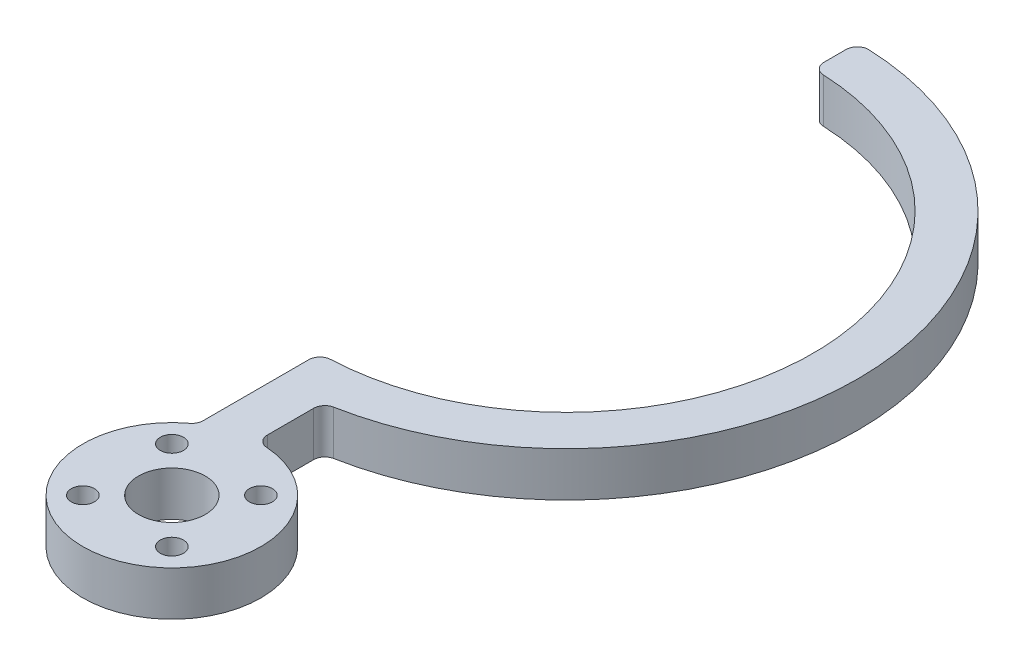
ISO-10303-21;
HEADER;
FILE_DESCRIPTION(('STEP AP214'),'2;1');
FILE_NAME('part.step','',(''),(''),'','','');
FILE_SCHEMA(('AUTOMOTIVE_DESIGN { 1 0 10303 214 1 1 1 1 }'));
ENDSEC;
DATA;
#1=APPLICATION_CONTEXT('core data for automotive mechanical design processes');
#2=APPLICATION_PROTOCOL_DEFINITION('international standard','automotive_design',2000,#1);
#3=PRODUCT_CONTEXT('',#1,'mechanical');
#4=PRODUCT('Part','Part','',(#3));
#5=PRODUCT_RELATED_PRODUCT_CATEGORY('part','',(#4));
#6=PRODUCT_DEFINITION_FORMATION('','',#4);
#7=PRODUCT_DEFINITION_CONTEXT('part definition',#1,'design');
#8=PRODUCT_DEFINITION('design','',#6,#7);
#9=PRODUCT_DEFINITION_SHAPE('','',#8);
#10=(LENGTH_UNIT() NAMED_UNIT(*) SI_UNIT(.MILLI.,.METRE.));
#11=(NAMED_UNIT(*) PLANE_ANGLE_UNIT() SI_UNIT($,.RADIAN.));
#12=(NAMED_UNIT(*) SI_UNIT($,.STERADIAN.) SOLID_ANGLE_UNIT());
#13=UNCERTAINTY_MEASURE_WITH_UNIT(LENGTH_MEASURE(1.E-05),#10,'distance_accuracy_value','');
#14=(GEOMETRIC_REPRESENTATION_CONTEXT(3) GLOBAL_UNCERTAINTY_ASSIGNED_CONTEXT((#13)) GLOBAL_UNIT_ASSIGNED_CONTEXT((#10,
#11,#12)) REPRESENTATION_CONTEXT('',''));
#15=CARTESIAN_POINT('',(0.,0.,0.));
#16=DIRECTION('',(0.,0.,1.));
#17=DIRECTION('',(1.,0.,0.));
#18=AXIS2_PLACEMENT_3D('',#15,#16,#17);
#19=CARTESIAN_POINT('',(8.79632836968887,8.,79.6950517100611));
#20=DIRECTION('',(0.,-1.,0.));
#21=DIRECTION('',(0.,0.,-1.));
#22=AXIS2_PLACEMENT_3D('',#19,#20,#21);
#23=CYLINDRICAL_SURFACE('',#22,16.);
#24=CARTESIAN_POINT('',(8.79632836968887,0.,79.6950517100611));
#25=DIRECTION('',(0.,1.,0.));
#26=DIRECTION('',(0.,0.,1.));
#27=AXIS2_PLACEMENT_3D('',#24,#25,#26);
#28=CIRCLE('',#27,16.);
#29=CARTESIAN_POINT('',(-0.800407958923447,0.,66.8926046065151));
#30=VERTEX_POINT('',#29);
#31=CARTESIAN_POINT('',(9.86625870774321,0.,63.7308652581397));
#32=VERTEX_POINT('',#31);
#33=EDGE_CURVE('E147',#30,#32,#28,.T.);
#34=ORIENTED_EDGE('',*,*,#33,.T.);
#35=DIRECTION('',(0.,-1.,0.));
#36=VECTOR('',#35,1.);
#37=CARTESIAN_POINT('',(9.86625870774321,8.,63.7308652581397));
#38=LINE('',#37,#36);
#39=CARTESIAN_POINT('',(9.86625870774321,8.,63.7308652581397));
#40=VERTEX_POINT('',#39);
#41=EDGE_CURVE('E164',#32,#40,#38,.F.);
#42=ORIENTED_EDGE('',*,*,#41,.T.);
#43=CARTESIAN_POINT('',(8.79632836968887,8.,79.6950517100611));
#44=DIRECTION('',(0.,1.,0.));
#45=DIRECTION('',(0.,0.,1.));
#46=AXIS2_PLACEMENT_3D('',#43,#44,#45);
#47=CIRCLE('',#46,16.);
#48=CARTESIAN_POINT('',(-0.800407958923447,8.,66.8926046065151));
#49=VERTEX_POINT('',#48);
#50=EDGE_CURVE('E216',#49,#40,#47,.T.);
#51=ORIENTED_EDGE('',*,*,#50,.F.);
#52=DIRECTION('',(0.,-1.,0.));
#53=VECTOR('',#52,1.);
#54=CARTESIAN_POINT('',(-0.800407958923447,8.,66.8926046065151));
#55=LINE('',#54,#53);
#56=EDGE_CURVE('E153',#49,#30,#55,.T.);
#57=ORIENTED_EDGE('',*,*,#56,.T.);
#58=EDGE_LOOP('',(#34,#42,#51,#57));
#59=FACE_BOUND('',#58,.T.);
#60=ADVANCED_FACE('F35',(#59),#23,.T.);
#61=CARTESIAN_POINT('',(7.99999999999999,8.,0.));
#62=DIRECTION('',(1.,0.,0.));
#63=DIRECTION('',(0.,0.,-1.));
#64=AXIS2_PLACEMENT_3D('',#61,#62,#63);
#65=PLANE('',#64);
#66=DIRECTION('',(0.,0.,1.));
#67=VECTOR('',#66,1.);
#68=CARTESIAN_POINT('',(7.99999999999999,8.,0.));
#69=LINE('',#68,#67);
#70=CARTESIAN_POINT('',(8.,8.,53.4017686973007));
#71=VERTEX_POINT('',#70);
#72=CARTESIAN_POINT('',(8.,8.,61.7353419516495));
#73=VERTEX_POINT('',#72);
#74=EDGE_CURVE('E220',#71,#73,#69,.T.);
#75=ORIENTED_EDGE('',*,*,#74,.T.);
#76=DIRECTION('',(0.,-1.,0.));
#77=VECTOR('',#76,1.);
#78=CARTESIAN_POINT('',(8.,8.,61.7353419516495));
#79=LINE('',#78,#77);
#80=CARTESIAN_POINT('',(8.,0.,61.7353419516495));
#81=VERTEX_POINT('',#80);
#82=EDGE_CURVE('E146',#73,#81,#79,.T.);
#83=ORIENTED_EDGE('',*,*,#82,.T.);
#84=DIRECTION('',(0.,0.,1.));
#85=VECTOR('',#84,1.);
#86=CARTESIAN_POINT('',(7.99999999999999,0.,0.));
#87=LINE('',#86,#85);
#88=CARTESIAN_POINT('',(8.,0.,53.4017686973007));
#89=VERTEX_POINT('',#88);
#90=EDGE_CURVE('E129',#89,#81,#87,.T.);
#91=ORIENTED_EDGE('',*,*,#90,.F.);
#92=DIRECTION('',(0.,-1.,0.));
#93=VECTOR('',#92,1.);
#94=CARTESIAN_POINT('',(8.,8.,53.4017686973007));
#95=LINE('',#94,#93);
#96=EDGE_CURVE('E143',#89,#71,#95,.F.);
#97=ORIENTED_EDGE('',*,*,#96,.T.);
#98=EDGE_LOOP('',(#75,#83,#91,#97));
#99=FACE_BOUND('',#98,.T.);
#100=ADVANCED_FACE('F142',(#99),#65,.T.);
#101=CARTESIAN_POINT('',(0.,8.,0.));
#102=DIRECTION('',(0.,-1.,0.));
#103=DIRECTION('',(0.,0.,-1.));
#104=AXIS2_PLACEMENT_3D('',#101,#102,#103);
#105=CYLINDRICAL_SURFACE('',#104,52.33);
#106=CARTESIAN_POINT('',(0.,8.,0.));
#107=DIRECTION('',(0.,1.,0.));
#108=DIRECTION('',(0.,0.,1.));
#109=AXIS2_PLACEMENT_3D('',#106,#107,#108);
#110=CIRCLE('',#109,52.33);
#111=CARTESIAN_POINT('',(9.6318792563961,8.,51.4359388170393));
#112=VERTEX_POINT('',#111);
#113=CARTESIAN_POINT('',(2.07947546195104,8.,-52.2886668581553));
#114=VERTEX_POINT('',#113);
#115=EDGE_CURVE('E223',#112,#114,#110,.T.);
#116=ORIENTED_EDGE('',*,*,#115,.F.);
#117=DIRECTION('',(0.,-1.,0.));
#118=VECTOR('',#117,1.);
#119=CARTESIAN_POINT('',(9.6318792563961,8.,51.4359388170393));
#120=LINE('',#119,#118);
#121=CARTESIAN_POINT('',(9.6318792563961,0.,51.4359388170393));
#122=VERTEX_POINT('',#121);
#123=EDGE_CURVE('E168',#112,#122,#120,.T.);
#124=ORIENTED_EDGE('',*,*,#123,.T.);
#125=CARTESIAN_POINT('',(0.,0.,0.));
#126=DIRECTION('',(0.,1.,0.));
#127=DIRECTION('',(0.,0.,1.));
#128=AXIS2_PLACEMENT_3D('',#125,#126,#127);
#129=CIRCLE('',#128,52.33);
#130=CARTESIAN_POINT('',(2.07947546195104,0.,-52.2886668581553));
#131=VERTEX_POINT('',#130);
#132=EDGE_CURVE('E131',#122,#131,#129,.T.);
#133=ORIENTED_EDGE('',*,*,#132,.T.);
#134=DIRECTION('',(0.,-1.,0.));
#135=VECTOR('',#134,1.);
#136=CARTESIAN_POINT('',(2.07947546195104,8.,-52.2886668581553));
#137=LINE('',#136,#135);
#138=EDGE_CURVE('E166',#131,#114,#137,.F.);
#139=ORIENTED_EDGE('',*,*,#138,.T.);
#140=EDGE_LOOP('',(#116,#124,#133,#139));
#141=FACE_BOUND('',#140,.T.);
#142=ADVANCED_FACE('F278',(#141),#105,.T.);
#143=CARTESIAN_POINT('',(0.,8.,0.));
#144=DIRECTION('',(1.,0.,0.));
#145=DIRECTION('',(0.,0.,-1.));
#146=AXIS2_PLACEMENT_3D('',#143,#144,#145);
#147=PLANE('',#146);
#148=DIRECTION('',(0.,0.,1.));
#149=VECTOR('',#148,1.);
#150=CARTESIAN_POINT('',(0.,0.,0.));
#151=LINE('',#150,#149);
#152=CARTESIAN_POINT('',(0.,0.,-50.2902465692902));
#153=VERTEX_POINT('',#152);
#154=CARTESIAN_POINT('',(0.,0.,-46.2868112965238));
#155=VERTEX_POINT('',#154);
#156=EDGE_CURVE('E252',#153,#155,#151,.T.);
#157=ORIENTED_EDGE('',*,*,#156,.T.);
#158=DIRECTION('',(0.,1.,0.));
#159=VECTOR('',#158,1.);
#160=CARTESIAN_POINT('',(0.,8.,-46.2868112965238));
#161=LINE('',#160,#159);
#162=CARTESIAN_POINT('',(0.,8.,-46.2868112965238));
#163=VERTEX_POINT('',#162);
#164=EDGE_CURVE('E50',#155,#163,#161,.T.);
#165=ORIENTED_EDGE('',*,*,#164,.T.);
#166=DIRECTION('',(0.,0.,1.));
#167=VECTOR('',#166,1.);
#168=CARTESIAN_POINT('',(0.,8.,0.));
#169=LINE('',#168,#167);
#170=CARTESIAN_POINT('',(0.,8.,-50.2902465692902));
#171=VERTEX_POINT('',#170);
#172=EDGE_CURVE('E231',#171,#163,#169,.T.);
#173=ORIENTED_EDGE('',*,*,#172,.F.);
#174=DIRECTION('',(0.,-1.,0.));
#175=VECTOR('',#174,1.);
#176=CARTESIAN_POINT('',(0.,8.,-50.2902465692902));
#177=LINE('',#176,#175);
#178=EDGE_CURVE('E191',#171,#153,#177,.T.);
#179=ORIENTED_EDGE('',*,*,#178,.T.);
#180=EDGE_LOOP('',(#157,#165,#173,#179));
#181=FACE_BOUND('',#180,.T.);
#182=ADVANCED_FACE('F375',(#181),#147,.F.);
#183=CARTESIAN_POINT('',(0.,8.,0.));
#184=DIRECTION('',(0.,-1.,0.));
#185=DIRECTION('',(0.,0.,-1.));
#186=AXIS2_PLACEMENT_3D('',#183,#184,#185);
#187=CYLINDRICAL_SURFACE('',#186,44.33);
#188=CARTESIAN_POINT('',(0.,0.,0.));
#189=DIRECTION('',(0.,1.,0.));
#190=DIRECTION('',(0.,0.,1.));
#191=AXIS2_PLACEMENT_3D('',#188,#189,#190);
#192=CIRCLE('',#191,44.33);
#193=CARTESIAN_POINT('',(1.9136628534427,0.,44.2886756912346));
#194=VERTEX_POINT('',#193);
#195=CARTESIAN_POINT('',(1.91366285344263,0.,-44.2886756912346));
#196=VERTEX_POINT('',#195);
#197=EDGE_CURVE('E209',#194,#196,#192,.T.);
#198=ORIENTED_EDGE('',*,*,#197,.F.);
#199=DIRECTION('',(0.,-1.,0.));
#200=VECTOR('',#199,1.);
#201=CARTESIAN_POINT('',(1.9136628534427,8.,44.2886756912346));
#202=LINE('',#201,#200);
#203=CARTESIAN_POINT('',(1.9136628534427,8.,44.2886756912346));
#204=VERTEX_POINT('',#203);
#205=EDGE_CURVE('E184',#194,#204,#202,.F.);
#206=ORIENTED_EDGE('',*,*,#205,.T.);
#207=CARTESIAN_POINT('',(0.,8.,0.));
#208=DIRECTION('',(0.,1.,0.));
#209=DIRECTION('',(0.,0.,1.));
#210=AXIS2_PLACEMENT_3D('',#207,#208,#209);
#211=CIRCLE('',#210,44.33);
#212=CARTESIAN_POINT('',(1.91366285344263,8.,-44.2886756912346));
#213=VERTEX_POINT('',#212);
#214=EDGE_CURVE('E156',#204,#213,#211,.T.);
#215=ORIENTED_EDGE('',*,*,#214,.T.);
#216=DIRECTION('',(0.,-1.,0.));
#217=VECTOR('',#216,1.);
#218=CARTESIAN_POINT('',(1.91366285344263,8.,-44.2886756912346));
#219=LINE('',#218,#217);
#220=EDGE_CURVE('E181',#213,#196,#219,.T.);
#221=ORIENTED_EDGE('',*,*,#220,.T.);
#222=EDGE_LOOP('',(#198,#206,#215,#221));
#223=FACE_BOUND('',#222,.T.);
#224=ADVANCED_FACE('F258',(#223),#187,.F.);
#225=CARTESIAN_POINT('',(0.796328369688872,8.,87.6950517100611));
#226=DIRECTION('',(0.,-1.,0.));
#227=DIRECTION('',(0.,0.,-1.));
#228=AXIS2_PLACEMENT_3D('',#225,#226,#227);
#229=CYLINDRICAL_SURFACE('',#228,2.07500000000001);
#230=CARTESIAN_POINT('',(0.796328369688872,8.,87.6950517100611));
#231=DIRECTION('',(0.,1.,0.));
#232=DIRECTION('',(0.,0.,1.));
#233=AXIS2_PLACEMENT_3D('',#230,#231,#232);
#234=CIRCLE('',#233,2.07500000000001);
#235=CARTESIAN_POINT('',(0.796328369688872,8.,89.7700517100611));
#236=VERTEX_POINT('',#235);
#237=EDGE_CURVE('E221',#236,#236,#234,.T.);
#238=ORIENTED_EDGE('',*,*,#237,.T.);
#239=EDGE_LOOP('',(#238));
#240=FACE_BOUND('',#239,.T.);
#241=CARTESIAN_POINT('',(0.796328369688872,0.,87.6950517100611));
#242=DIRECTION('',(0.,1.,0.));
#243=DIRECTION('',(0.,0.,1.));
#244=AXIS2_PLACEMENT_3D('',#241,#242,#243);
#245=CIRCLE('',#244,2.07500000000001);
#246=CARTESIAN_POINT('',(0.796328369688872,0.,89.7700517100611));
#247=VERTEX_POINT('',#246);
#248=EDGE_CURVE('E247',#247,#247,#245,.T.);
#249=ORIENTED_EDGE('',*,*,#248,.F.);
#250=EDGE_LOOP('',(#249));
#251=FACE_BOUND('',#250,.T.);
#252=ADVANCED_FACE('F282',(#240,#251),#229,.F.);
#253=CARTESIAN_POINT('',(16.7963283696889,8.,87.6950517100611));
#254=DIRECTION('',(0.,-1.,0.));
#255=DIRECTION('',(0.,0.,-1.));
#256=AXIS2_PLACEMENT_3D('',#253,#254,#255);
#257=CYLINDRICAL_SURFACE('',#256,2.07500000000001);
#258=CARTESIAN_POINT('',(16.7963283696889,8.,87.6950517100611));
#259=DIRECTION('',(0.,1.,0.));
#260=DIRECTION('',(0.,0.,1.));
#261=AXIS2_PLACEMENT_3D('',#258,#259,#260);
#262=CIRCLE('',#261,2.07500000000001);
#263=CARTESIAN_POINT('',(16.7963283696889,8.,89.7700517100611));
#264=VERTEX_POINT('',#263);
#265=EDGE_CURVE('E226',#264,#264,#262,.T.);
#266=ORIENTED_EDGE('',*,*,#265,.T.);
#267=EDGE_LOOP('',(#266));
#268=FACE_BOUND('',#267,.T.);
#269=CARTESIAN_POINT('',(16.7963283696889,0.,87.6950517100611));
#270=DIRECTION('',(0.,1.,0.));
#271=DIRECTION('',(0.,0.,1.));
#272=AXIS2_PLACEMENT_3D('',#269,#270,#271);
#273=CIRCLE('',#272,2.07500000000001);
#274=CARTESIAN_POINT('',(16.7963283696889,0.,89.7700517100611));
#275=VERTEX_POINT('',#274);
#276=EDGE_CURVE('E244',#275,#275,#273,.T.);
#277=ORIENTED_EDGE('',*,*,#276,.F.);
#278=EDGE_LOOP('',(#277));
#279=FACE_BOUND('',#278,.T.);
#280=ADVANCED_FACE('F285',(#268,#279),#257,.F.);
#281=CARTESIAN_POINT('',(16.7963283696889,8.,71.6950517100611));
#282=DIRECTION('',(0.,-1.,0.));
#283=DIRECTION('',(0.,0.,-1.));
#284=AXIS2_PLACEMENT_3D('',#281,#282,#283);
#285=CYLINDRICAL_SURFACE('',#284,2.075);
#286=CARTESIAN_POINT('',(16.7963283696889,8.,71.6950517100611));
#287=DIRECTION('',(0.,1.,0.));
#288=DIRECTION('',(0.,0.,1.));
#289=AXIS2_PLACEMENT_3D('',#286,#287,#288);
#290=CIRCLE('',#289,2.075);
#291=CARTESIAN_POINT('',(16.7963283696889,8.,73.7700517100611));
#292=VERTEX_POINT('',#291);
#293=EDGE_CURVE('E453',#292,#292,#290,.T.);
#294=ORIENTED_EDGE('',*,*,#293,.T.);
#295=EDGE_LOOP('',(#294));
#296=FACE_BOUND('',#295,.T.);
#297=CARTESIAN_POINT('',(16.7963283696889,0.,71.6950517100611));
#298=DIRECTION('',(0.,1.,0.));
#299=DIRECTION('',(0.,0.,1.));
#300=AXIS2_PLACEMENT_3D('',#297,#298,#299);
#301=CIRCLE('',#300,2.075);
#302=CARTESIAN_POINT('',(16.7963283696889,0.,73.7700517100611));
#303=VERTEX_POINT('',#302);
#304=EDGE_CURVE('E241',#303,#303,#301,.T.);
#305=ORIENTED_EDGE('',*,*,#304,.F.);
#306=EDGE_LOOP('',(#305));
#307=FACE_BOUND('',#306,.T.);
#308=ADVANCED_FACE('F289',(#296,#307),#285,.F.);
#309=CARTESIAN_POINT('',(0.796328369688872,8.,71.6950517100611));
#310=DIRECTION('',(0.,-1.,0.));
#311=DIRECTION('',(0.,0.,-1.));
#312=AXIS2_PLACEMENT_3D('',#309,#310,#311);
#313=CYLINDRICAL_SURFACE('',#312,2.07500000000001);
#314=CARTESIAN_POINT('',(0.796328369688872,8.,71.6950517100611));
#315=DIRECTION('',(0.,1.,0.));
#316=DIRECTION('',(0.,0.,1.));
#317=AXIS2_PLACEMENT_3D('',#314,#315,#316);
#318=CIRCLE('',#317,2.07500000000001);
#319=CARTESIAN_POINT('',(0.796328369688872,8.,73.7700517100611));
#320=VERTEX_POINT('',#319);
#321=EDGE_CURVE('E449',#320,#320,#318,.T.);
#322=ORIENTED_EDGE('',*,*,#321,.T.);
#323=EDGE_LOOP('',(#322));
#324=FACE_BOUND('',#323,.T.);
#325=CARTESIAN_POINT('',(0.796328369688872,0.,71.6950517100611));
#326=DIRECTION('',(0.,1.,0.));
#327=DIRECTION('',(0.,0.,1.));
#328=AXIS2_PLACEMENT_3D('',#325,#326,#327);
#329=CIRCLE('',#328,2.07500000000001);
#330=CARTESIAN_POINT('',(0.796328369688872,0.,73.7700517100611));
#331=VERTEX_POINT('',#330);
#332=EDGE_CURVE('E238',#331,#331,#329,.T.);
#333=ORIENTED_EDGE('',*,*,#332,.F.);
#334=EDGE_LOOP('',(#333));
#335=FACE_BOUND('',#334,.T.);
#336=ADVANCED_FACE('F293',(#324,#335),#313,.F.);
#337=CARTESIAN_POINT('',(8.79632836968887,8.,79.6950517100611));
#338=DIRECTION('',(0.,-1.,0.));
#339=DIRECTION('',(0.,0.,-1.));
#340=AXIS2_PLACEMENT_3D('',#337,#338,#339);
#341=CYLINDRICAL_SURFACE('',#340,6.00320826308857);
#342=CARTESIAN_POINT('',(8.79632836968887,8.,79.6950517100611));
#343=DIRECTION('',(0.,1.,0.));
#344=DIRECTION('',(0.,0.,1.));
#345=AXIS2_PLACEMENT_3D('',#342,#343,#344);
#346=CIRCLE('',#345,6.00320826308857);
#347=CARTESIAN_POINT('',(8.79632836968887,8.,85.6982599731496));
#348=VERTEX_POINT('',#347);
#349=EDGE_CURVE('E208',#348,#348,#346,.T.);
#350=ORIENTED_EDGE('',*,*,#349,.T.);
#351=EDGE_LOOP('',(#350));
#352=FACE_BOUND('',#351,.T.);
#353=CARTESIAN_POINT('',(8.79632836968887,0.,79.6950517100611));
#354=DIRECTION('',(0.,1.,0.));
#355=DIRECTION('',(0.,0.,1.));
#356=AXIS2_PLACEMENT_3D('',#353,#354,#355);
#357=CIRCLE('',#356,6.00320826308857);
#358=CARTESIAN_POINT('',(8.79632836968887,0.,85.6982599731496));
#359=VERTEX_POINT('',#358);
#360=EDGE_CURVE('E235',#359,#359,#357,.T.);
#361=ORIENTED_EDGE('',*,*,#360,.F.);
#362=EDGE_LOOP('',(#361));
#363=FACE_BOUND('',#362,.T.);
#364=ADVANCED_FACE('F297',(#352,#363),#341,.F.);
#365=CARTESIAN_POINT('',(0.,8.,0.));
#366=DIRECTION('',(1.,0.,0.));
#367=DIRECTION('',(0.,0.,-1.));
#368=AXIS2_PLACEMENT_3D('',#365,#366,#367);
#369=PLANE('',#368);
#370=DIRECTION('',(0.,0.,1.));
#371=VECTOR('',#370,1.);
#372=CARTESIAN_POINT('',(0.,0.,0.));
#373=LINE('',#372,#371);
#374=CARTESIAN_POINT('',(0.,0.,46.2868112965238));
#375=VERTEX_POINT('',#374);
#376=CARTESIAN_POINT('',(0.,0.,65.2922987185719));
#377=VERTEX_POINT('',#376);
#378=EDGE_CURVE('E159',#375,#377,#373,.T.);
#379=ORIENTED_EDGE('',*,*,#378,.T.);
#380=DIRECTION('',(0.,1.,0.));
#381=VECTOR('',#380,1.);
#382=CARTESIAN_POINT('',(0.,8.,65.2922987185719));
#383=LINE('',#382,#381);
#384=CARTESIAN_POINT('',(0.,8.,65.2922987185719));
#385=VERTEX_POINT('',#384);
#386=EDGE_CURVE('E173',#377,#385,#383,.T.);
#387=ORIENTED_EDGE('',*,*,#386,.T.);
#388=DIRECTION('',(0.,0.,1.));
#389=VECTOR('',#388,1.);
#390=CARTESIAN_POINT('',(0.,8.,0.));
#391=LINE('',#390,#389);
#392=CARTESIAN_POINT('',(0.,8.,46.2868112965238));
#393=VERTEX_POINT('',#392);
#394=EDGE_CURVE('E151',#393,#385,#391,.T.);
#395=ORIENTED_EDGE('',*,*,#394,.F.);
#396=DIRECTION('',(0.,1.,0.));
#397=VECTOR('',#396,1.);
#398=CARTESIAN_POINT('',(0.,0.,46.2868112965238));
#399=LINE('',#398,#397);
#400=EDGE_CURVE('E170',#393,#375,#399,.F.);
#401=ORIENTED_EDGE('',*,*,#400,.T.);
#402=EDGE_LOOP('',(#379,#387,#395,#401));
#403=FACE_BOUND('',#402,.T.);
#404=ADVANCED_FACE('F205',(#403),#369,.F.);
#405=CARTESIAN_POINT('',(0.,8.,0.));
#406=DIRECTION('',(0.,1.,0.));
#407=DIRECTION('',(0.,0.,1.));
#408=AXIS2_PLACEMENT_3D('',#405,#406,#407);
#409=PLANE('',#408);
#410=ORIENTED_EDGE('',*,*,#349,.F.);
#411=EDGE_LOOP('',(#410));
#412=FACE_BOUND('',#411,.T.);
#413=ORIENTED_EDGE('',*,*,#321,.F.);
#414=EDGE_LOOP('',(#413));
#415=FACE_BOUND('',#414,.T.);
#416=ORIENTED_EDGE('',*,*,#293,.F.);
#417=EDGE_LOOP('',(#416));
#418=FACE_BOUND('',#417,.T.);
#419=ORIENTED_EDGE('',*,*,#265,.F.);
#420=EDGE_LOOP('',(#419));
#421=FACE_BOUND('',#420,.T.);
#422=ORIENTED_EDGE('',*,*,#237,.F.);
#423=EDGE_LOOP('',(#422));
#424=FACE_BOUND('',#423,.T.);
#425=ORIENTED_EDGE('',*,*,#214,.F.);
#426=CARTESIAN_POINT('',(2.00000000000001,8.,46.2868112965238));
#427=DIRECTION('',(0.,1.,0.));
#428=DIRECTION('',(0.,0.,1.));
#429=AXIS2_PLACEMENT_3D('',#426,#427,#428);
#430=CIRCLE('',#429,2.);
#431=EDGE_CURVE('E189',#204,#393,#430,.T.);
#432=ORIENTED_EDGE('',*,*,#431,.T.);
#433=ORIENTED_EDGE('',*,*,#394,.T.);
#434=CARTESIAN_POINT('',(-1.99999999999999,8.,65.2922987185719));
#435=DIRECTION('',(0.,1.,0.));
#436=DIRECTION('',(0.,0.,1.));
#437=AXIS2_PLACEMENT_3D('',#434,#435,#436);
#438=CIRCLE('',#437,2.);
#439=EDGE_CURVE('E11',#385,#49,#438,.F.);
#440=ORIENTED_EDGE('',*,*,#439,.T.);
#441=ORIENTED_EDGE('',*,*,#50,.T.);
#442=CARTESIAN_POINT('',(10.,8.,61.7353419516495));
#443=DIRECTION('',(0.,1.,0.));
#444=DIRECTION('',(0.,0.,1.));
#445=AXIS2_PLACEMENT_3D('',#442,#443,#444);
#446=CIRCLE('',#445,2.);
#447=EDGE_CURVE('E137',#40,#73,#446,.F.);
#448=ORIENTED_EDGE('',*,*,#447,.T.);
#449=ORIENTED_EDGE('',*,*,#74,.F.);
#450=CARTESIAN_POINT('',(10.,8.,53.4017686973007));
#451=DIRECTION('',(0.,1.,0.));
#452=DIRECTION('',(0.,0.,1.));
#453=AXIS2_PLACEMENT_3D('',#450,#451,#452);
#454=CIRCLE('',#453,2.);
#455=EDGE_CURVE('E136',#71,#112,#454,.F.);
#456=ORIENTED_EDGE('',*,*,#455,.T.);
#457=ORIENTED_EDGE('',*,*,#115,.T.);
#458=CARTESIAN_POINT('',(1.99999999999993,8.,-50.2902465692902));
#459=DIRECTION('',(0.,1.,0.));
#460=DIRECTION('',(0.,0.,1.));
#461=AXIS2_PLACEMENT_3D('',#458,#459,#460);
#462=CIRCLE('',#461,2.);
#463=EDGE_CURVE('E57',#114,#171,#462,.T.);
#464=ORIENTED_EDGE('',*,*,#463,.T.);
#465=ORIENTED_EDGE('',*,*,#172,.T.);
#466=CARTESIAN_POINT('',(1.99999999999993,8.,-46.2868112965238));
#467=DIRECTION('',(0.,1.,0.));
#468=DIRECTION('',(0.,0.,1.));
#469=AXIS2_PLACEMENT_3D('',#466,#467,#468);
#470=CIRCLE('',#469,2.);
#471=EDGE_CURVE('E187',#163,#213,#470,.T.);
#472=ORIENTED_EDGE('',*,*,#471,.T.);
#473=EDGE_LOOP('',(#425,#432,#433,#440,#441,#448,#449,#456,#457,#464,#465,#472));
#474=FACE_BOUND('',#473,.T.);
#475=ADVANCED_FACE('F215',(#412,#415,#418,#421,#424,#474),#409,.T.);
#476=CARTESIAN_POINT('',(0.,0.,0.));
#477=DIRECTION('',(0.,1.,0.));
#478=DIRECTION('',(0.,0.,1.));
#479=AXIS2_PLACEMENT_3D('',#476,#477,#478);
#480=PLANE('',#479);
#481=ORIENTED_EDGE('',*,*,#360,.T.);
#482=EDGE_LOOP('',(#481));
#483=FACE_BOUND('',#482,.T.);
#484=ORIENTED_EDGE('',*,*,#332,.T.);
#485=EDGE_LOOP('',(#484));
#486=FACE_BOUND('',#485,.T.);
#487=ORIENTED_EDGE('',*,*,#304,.T.);
#488=EDGE_LOOP('',(#487));
#489=FACE_BOUND('',#488,.T.);
#490=ORIENTED_EDGE('',*,*,#276,.T.);
#491=EDGE_LOOP('',(#490));
#492=FACE_BOUND('',#491,.T.);
#493=ORIENTED_EDGE('',*,*,#248,.T.);
#494=EDGE_LOOP('',(#493));
#495=FACE_BOUND('',#494,.T.);
#496=ORIENTED_EDGE('',*,*,#378,.F.);
#497=CARTESIAN_POINT('',(2.00000000000001,0.,46.2868112965238));
#498=DIRECTION('',(0.,1.,0.));
#499=DIRECTION('',(0.,0.,1.));
#500=AXIS2_PLACEMENT_3D('',#497,#498,#499);
#501=CIRCLE('',#500,2.);
#502=EDGE_CURVE('E179',#375,#194,#501,.F.);
#503=ORIENTED_EDGE('',*,*,#502,.T.);
#504=ORIENTED_EDGE('',*,*,#197,.T.);
#505=CARTESIAN_POINT('',(1.99999999999993,0.,-46.2868112965238));
#506=DIRECTION('',(0.,1.,0.));
#507=DIRECTION('',(0.,0.,1.));
#508=AXIS2_PLACEMENT_3D('',#505,#506,#507);
#509=CIRCLE('',#508,2.);
#510=EDGE_CURVE('E177',#196,#155,#509,.F.);
#511=ORIENTED_EDGE('',*,*,#510,.T.);
#512=ORIENTED_EDGE('',*,*,#156,.F.);
#513=CARTESIAN_POINT('',(1.99999999999993,0.,-50.2902465692902));
#514=DIRECTION('',(0.,1.,0.));
#515=DIRECTION('',(0.,0.,1.));
#516=AXIS2_PLACEMENT_3D('',#513,#514,#515);
#517=CIRCLE('',#516,2.);
#518=EDGE_CURVE('E175',#153,#131,#517,.F.);
#519=ORIENTED_EDGE('',*,*,#518,.T.);
#520=ORIENTED_EDGE('',*,*,#132,.F.);
#521=CARTESIAN_POINT('',(10.,0.,53.4017686973007));
#522=DIRECTION('',(0.,1.,0.));
#523=DIRECTION('',(0.,0.,1.));
#524=AXIS2_PLACEMENT_3D('',#521,#522,#523);
#525=CIRCLE('',#524,2.);
#526=EDGE_CURVE('E125',#122,#89,#525,.T.);
#527=ORIENTED_EDGE('',*,*,#526,.T.);
#528=ORIENTED_EDGE('',*,*,#90,.T.);
#529=CARTESIAN_POINT('',(10.,0.,61.7353419516495));
#530=DIRECTION('',(0.,1.,0.));
#531=DIRECTION('',(0.,0.,1.));
#532=AXIS2_PLACEMENT_3D('',#529,#530,#531);
#533=CIRCLE('',#532,2.);
#534=EDGE_CURVE('E195',#81,#32,#533,.T.);
#535=ORIENTED_EDGE('',*,*,#534,.T.);
#536=ORIENTED_EDGE('',*,*,#33,.F.);
#537=CARTESIAN_POINT('',(-1.99999999999999,0.,65.2922987185719));
#538=DIRECTION('',(0.,1.,0.));
#539=DIRECTION('',(0.,0.,1.));
#540=AXIS2_PLACEMENT_3D('',#537,#538,#539);
#541=CIRCLE('',#540,2.);
#542=EDGE_CURVE('E43',#30,#377,#541,.T.);
#543=ORIENTED_EDGE('',*,*,#542,.T.);
#544=EDGE_LOOP('',(#496,#503,#504,#511,#512,#519,#520,#527,#528,#535,#536,#543));
#545=FACE_BOUND('',#544,.T.);
#546=ADVANCED_FACE('F128',(#483,#486,#489,#492,#495,#545),#480,.F.);
#547=CARTESIAN_POINT('',(10.,8.,61.7353419516495));
#548=DIRECTION('',(0.,-1.,0.));
#549=DIRECTION('',(0.,0.,-1.));
#550=AXIS2_PLACEMENT_3D('',#547,#548,#549);
#551=CYLINDRICAL_SURFACE('',#550,2.);
#552=ORIENTED_EDGE('',*,*,#447,.F.);
#553=ORIENTED_EDGE('',*,*,#41,.F.);
#554=ORIENTED_EDGE('',*,*,#534,.F.);
#555=ORIENTED_EDGE('',*,*,#82,.F.);
#556=EDGE_LOOP('',(#552,#553,#554,#555));
#557=FACE_BOUND('',#556,.T.);
#558=ADVANCED_FACE('F302',(#557),#551,.F.);
#559=CARTESIAN_POINT('',(10.,8.,53.4017686973007));
#560=DIRECTION('',(0.,-1.,0.));
#561=DIRECTION('',(0.,0.,-1.));
#562=AXIS2_PLACEMENT_3D('',#559,#560,#561);
#563=CYLINDRICAL_SURFACE('',#562,2.);
#564=ORIENTED_EDGE('',*,*,#455,.F.);
#565=ORIENTED_EDGE('',*,*,#96,.F.);
#566=ORIENTED_EDGE('',*,*,#526,.F.);
#567=ORIENTED_EDGE('',*,*,#123,.F.);
#568=EDGE_LOOP('',(#564,#565,#566,#567));
#569=FACE_BOUND('',#568,.T.);
#570=ADVANCED_FACE('F150',(#569),#563,.F.);
#571=CARTESIAN_POINT('',(-1.99999999999999,8.,65.2922987185719));
#572=DIRECTION('',(0.,-1.,0.));
#573=DIRECTION('',(0.,0.,-1.));
#574=AXIS2_PLACEMENT_3D('',#571,#572,#573);
#575=CYLINDRICAL_SURFACE('',#574,2.);
#576=ORIENTED_EDGE('',*,*,#439,.F.);
#577=ORIENTED_EDGE('',*,*,#386,.F.);
#578=ORIENTED_EDGE('',*,*,#542,.F.);
#579=ORIENTED_EDGE('',*,*,#56,.F.);
#580=EDGE_LOOP('',(#576,#577,#578,#579));
#581=FACE_BOUND('',#580,.T.);
#582=ADVANCED_FACE('F211',(#581),#575,.F.);
#583=CARTESIAN_POINT('',(2.00000000000001,8.,46.2868112965238));
#584=DIRECTION('',(0.,-1.,0.));
#585=DIRECTION('',(0.,0.,-1.));
#586=AXIS2_PLACEMENT_3D('',#583,#584,#585);
#587=CYLINDRICAL_SURFACE('',#586,2.);
#588=ORIENTED_EDGE('',*,*,#431,.F.);
#589=ORIENTED_EDGE('',*,*,#205,.F.);
#590=ORIENTED_EDGE('',*,*,#502,.F.);
#591=ORIENTED_EDGE('',*,*,#400,.F.);
#592=EDGE_LOOP('',(#588,#589,#590,#591));
#593=FACE_BOUND('',#592,.T.);
#594=ADVANCED_FACE('F262',(#593),#587,.T.);
#595=CARTESIAN_POINT('',(1.99999999999993,8.,-46.2868112965238));
#596=DIRECTION('',(0.,-1.,0.));
#597=DIRECTION('',(0.,0.,-1.));
#598=AXIS2_PLACEMENT_3D('',#595,#596,#597);
#599=CYLINDRICAL_SURFACE('',#598,2.);
#600=ORIENTED_EDGE('',*,*,#471,.F.);
#601=ORIENTED_EDGE('',*,*,#164,.F.);
#602=ORIENTED_EDGE('',*,*,#510,.F.);
#603=ORIENTED_EDGE('',*,*,#220,.F.);
#604=EDGE_LOOP('',(#600,#601,#602,#603));
#605=FACE_BOUND('',#604,.T.);
#606=ADVANCED_FACE('F265',(#605),#599,.T.);
#607=CARTESIAN_POINT('',(1.99999999999993,8.,-50.2902465692902));
#608=DIRECTION('',(0.,-1.,0.));
#609=DIRECTION('',(0.,0.,-1.));
#610=AXIS2_PLACEMENT_3D('',#607,#608,#609);
#611=CYLINDRICAL_SURFACE('',#610,2.);
#612=ORIENTED_EDGE('',*,*,#463,.F.);
#613=ORIENTED_EDGE('',*,*,#138,.F.);
#614=ORIENTED_EDGE('',*,*,#518,.F.);
#615=ORIENTED_EDGE('',*,*,#178,.F.);
#616=EDGE_LOOP('',(#612,#613,#614,#615));
#617=FACE_BOUND('',#616,.T.);
#618=ADVANCED_FACE('F37',(#617),#611,.T.);
#619=CLOSED_SHELL('',(#60,#100,#142,#182,#224,#252,#280,#308,#336,#364,#404,#475,#546,#558,#570,
#582,#594,#606,#618));
#620=MANIFOLD_SOLID_BREP('B2',#619);
#621=ADVANCED_BREP_SHAPE_REPRESENTATION('',(#18,#620),#14);
#622=SHAPE_DEFINITION_REPRESENTATION(#9,#621);
ENDSEC;
END-ISO-10303-21;
